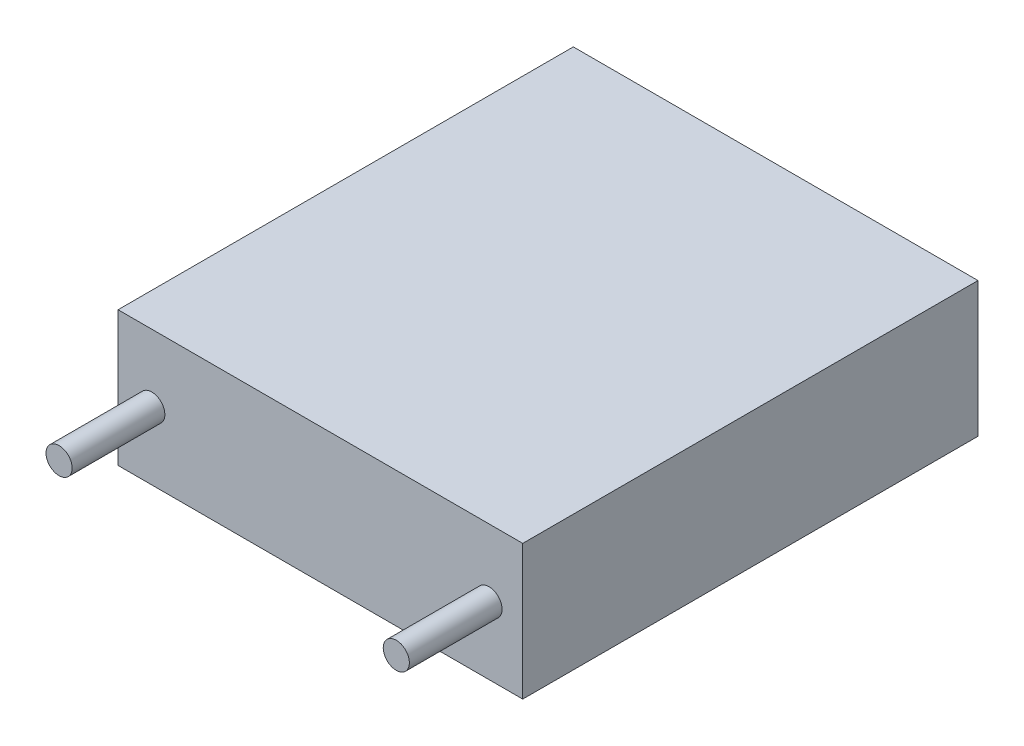
ISO-10303-21;
HEADER;
FILE_DESCRIPTION(('STEP AP214'),'2;1');
FILE_NAME('part.step','',(''),(''),'','','');
FILE_SCHEMA(('AUTOMOTIVE_DESIGN { 1 0 10303 214 1 1 1 1 }'));
ENDSEC;
DATA;
#1=APPLICATION_CONTEXT('core data for automotive mechanical design processes');
#2=APPLICATION_PROTOCOL_DEFINITION('international standard','automotive_design',2000,#1);
#3=PRODUCT_CONTEXT('',#1,'mechanical');
#4=PRODUCT('Part','Part','',(#3));
#5=PRODUCT_RELATED_PRODUCT_CATEGORY('part','',(#4));
#6=PRODUCT_DEFINITION_FORMATION('','',#4);
#7=PRODUCT_DEFINITION_CONTEXT('part definition',#1,'design');
#8=PRODUCT_DEFINITION('design','',#6,#7);
#9=PRODUCT_DEFINITION_SHAPE('','',#8);
#10=(LENGTH_UNIT() NAMED_UNIT(*) SI_UNIT(.MILLI.,.METRE.));
#11=(NAMED_UNIT(*) PLANE_ANGLE_UNIT() SI_UNIT($,.RADIAN.));
#12=(NAMED_UNIT(*) SI_UNIT($,.STERADIAN.) SOLID_ANGLE_UNIT());
#13=UNCERTAINTY_MEASURE_WITH_UNIT(LENGTH_MEASURE(1.E-05),#10,'distance_accuracy_value','');
#14=(GEOMETRIC_REPRESENTATION_CONTEXT(3) GLOBAL_UNCERTAINTY_ASSIGNED_CONTEXT((#13)) GLOBAL_UNIT_ASSIGNED_CONTEXT((#10,
#11,#12)) REPRESENTATION_CONTEXT('',''));
#15=CARTESIAN_POINT('',(0.,0.,0.));
#16=DIRECTION('',(0.,0.,1.));
#17=DIRECTION('',(1.,0.,0.));
#18=AXIS2_PLACEMENT_3D('',#15,#16,#17);
#19=CARTESIAN_POINT('',(0.,8.,27.));
#20=DIRECTION('',(0.,0.,-1.));
#21=DIRECTION('',(-1.,0.,0.));
#22=AXIS2_PLACEMENT_3D('',#19,#20,#21);
#23=PLANE('',#22);
#24=CARTESIAN_POINT('',(2.,4.,27.));
#25=DIRECTION('',(0.,0.,-1.));
#26=DIRECTION('',(-1.,0.,0.));
#27=AXIS2_PLACEMENT_3D('',#24,#25,#26);
#28=CIRCLE('',#27,0.774571480334662);
#29=CARTESIAN_POINT('',(1.22542851966534,4.,27.));
#30=VERTEX_POINT('',#29);
#31=EDGE_CURVE('E37',#30,#30,#28,.F.);
#32=ORIENTED_EDGE('',*,*,#31,.F.);
#33=EDGE_LOOP('',(#32));
#34=FACE_BOUND('',#33,.T.);
#35=DIRECTION('',(0.,-1.,0.));
#36=VECTOR('',#35,1.);
#37=CARTESIAN_POINT('',(0.,0.,27.));
#38=LINE('',#37,#36);
#39=CARTESIAN_POINT('',(0.,8.,27.));
#40=VERTEX_POINT('',#39);
#41=CARTESIAN_POINT('',(0.,0.,27.));
#42=VERTEX_POINT('',#41);
#43=EDGE_CURVE('E101',#40,#42,#38,.T.);
#44=ORIENTED_EDGE('',*,*,#43,.T.);
#45=DIRECTION('',(1.,0.,0.));
#46=VECTOR('',#45,1.);
#47=CARTESIAN_POINT('',(0.,0.,27.));
#48=LINE('',#47,#46);
#49=CARTESIAN_POINT('',(24.,0.,27.));
#50=VERTEX_POINT('',#49);
#51=EDGE_CURVE('E84',#42,#50,#48,.T.);
#52=ORIENTED_EDGE('',*,*,#51,.T.);
#53=DIRECTION('',(0.,1.,0.));
#54=VECTOR('',#53,1.);
#55=CARTESIAN_POINT('',(24.,0.,27.));
#56=LINE('',#55,#54);
#57=CARTESIAN_POINT('',(24.,8.,27.));
#58=VERTEX_POINT('',#57);
#59=EDGE_CURVE('E49',#50,#58,#56,.T.);
#60=ORIENTED_EDGE('',*,*,#59,.T.);
#61=DIRECTION('',(-1.,0.,0.));
#62=VECTOR('',#61,1.);
#63=CARTESIAN_POINT('',(0.,8.,27.));
#64=LINE('',#63,#62);
#65=EDGE_CURVE('E44',#58,#40,#64,.T.);
#66=ORIENTED_EDGE('',*,*,#65,.T.);
#67=EDGE_LOOP('',(#44,#52,#60,#66));
#68=FACE_BOUND('',#67,.T.);
#69=CARTESIAN_POINT('',(22.,4.,27.));
#70=DIRECTION('',(0.,0.,-1.));
#71=DIRECTION('',(-1.,0.,0.));
#72=AXIS2_PLACEMENT_3D('',#69,#70,#71);
#73=CIRCLE('',#72,0.774571480334662);
#74=CARTESIAN_POINT('',(21.2254285196653,4.,27.));
#75=VERTEX_POINT('',#74);
#76=EDGE_CURVE('E11',#75,#75,#73,.F.);
#77=ORIENTED_EDGE('',*,*,#76,.F.);
#78=EDGE_LOOP('',(#77));
#79=FACE_BOUND('',#78,.T.);
#80=ADVANCED_FACE('F29',(#34,#68,#79),#23,.F.);
#81=CARTESIAN_POINT('',(0.,0.,27.));
#82=DIRECTION('',(1.,0.,0.));
#83=DIRECTION('',(0.,0.,-1.));
#84=AXIS2_PLACEMENT_3D('',#81,#82,#83);
#85=PLANE('',#84);
#86=DIRECTION('',(0.,-1.,0.));
#87=VECTOR('',#86,1.);
#88=CARTESIAN_POINT('',(0.,0.,0.));
#89=LINE('',#88,#87);
#90=CARTESIAN_POINT('',(0.,8.,0.));
#91=VERTEX_POINT('',#90);
#92=CARTESIAN_POINT('',(0.,0.,0.));
#93=VERTEX_POINT('',#92);
#94=EDGE_CURVE('E75',#91,#93,#89,.T.);
#95=ORIENTED_EDGE('',*,*,#94,.T.);
#96=DIRECTION('',(0.,0.,-1.));
#97=VECTOR('',#96,1.);
#98=CARTESIAN_POINT('',(0.,0.,27.));
#99=LINE('',#98,#97);
#100=EDGE_CURVE('E82',#42,#93,#99,.T.);
#101=ORIENTED_EDGE('',*,*,#100,.F.);
#102=ORIENTED_EDGE('',*,*,#43,.F.);
#103=DIRECTION('',(0.,0.,-1.));
#104=VECTOR('',#103,1.);
#105=CARTESIAN_POINT('',(0.,8.,27.));
#106=LINE('',#105,#104);
#107=EDGE_CURVE('E90',#40,#91,#106,.T.);
#108=ORIENTED_EDGE('',*,*,#107,.T.);
#109=EDGE_LOOP('',(#95,#101,#102,#108));
#110=FACE_BOUND('',#109,.T.);
#111=ADVANCED_FACE('F31',(#110),#85,.F.);
#112=CARTESIAN_POINT('',(0.,0.,27.));
#113=DIRECTION('',(0.,1.,0.));
#114=DIRECTION('',(0.,0.,1.));
#115=AXIS2_PLACEMENT_3D('',#112,#113,#114);
#116=PLANE('',#115);
#117=DIRECTION('',(1.,0.,0.));
#118=VECTOR('',#117,1.);
#119=CARTESIAN_POINT('',(0.,0.,0.));
#120=LINE('',#119,#118);
#121=CARTESIAN_POINT('',(24.,0.,0.));
#122=VERTEX_POINT('',#121);
#123=EDGE_CURVE('E70',#93,#122,#120,.T.);
#124=ORIENTED_EDGE('',*,*,#123,.T.);
#125=DIRECTION('',(0.,0.,-1.));
#126=VECTOR('',#125,1.);
#127=CARTESIAN_POINT('',(24.,0.,27.));
#128=LINE('',#127,#126);
#129=EDGE_CURVE('E87',#50,#122,#128,.T.);
#130=ORIENTED_EDGE('',*,*,#129,.F.);
#131=ORIENTED_EDGE('',*,*,#51,.F.);
#132=ORIENTED_EDGE('',*,*,#100,.T.);
#133=EDGE_LOOP('',(#124,#130,#131,#132));
#134=FACE_BOUND('',#133,.T.);
#135=ADVANCED_FACE('F83',(#134),#116,.F.);
#136=CARTESIAN_POINT('',(24.,0.,27.));
#137=DIRECTION('',(-1.,0.,0.));
#138=DIRECTION('',(0.,0.,1.));
#139=AXIS2_PLACEMENT_3D('',#136,#137,#138);
#140=PLANE('',#139);
#141=DIRECTION('',(0.,1.,0.));
#142=VECTOR('',#141,1.);
#143=CARTESIAN_POINT('',(24.,0.,0.));
#144=LINE('',#143,#142);
#145=CARTESIAN_POINT('',(24.,8.,0.));
#146=VERTEX_POINT('',#145);
#147=EDGE_CURVE('E76',#122,#146,#144,.T.);
#148=ORIENTED_EDGE('',*,*,#147,.T.);
#149=DIRECTION('',(0.,0.,-1.));
#150=VECTOR('',#149,1.);
#151=CARTESIAN_POINT('',(24.,8.,27.));
#152=LINE('',#151,#150);
#153=EDGE_CURVE('E107',#58,#146,#152,.T.);
#154=ORIENTED_EDGE('',*,*,#153,.F.);
#155=ORIENTED_EDGE('',*,*,#59,.F.);
#156=ORIENTED_EDGE('',*,*,#129,.T.);
#157=EDGE_LOOP('',(#148,#154,#155,#156));
#158=FACE_BOUND('',#157,.T.);
#159=ADVANCED_FACE('F144',(#158),#140,.F.);
#160=CARTESIAN_POINT('',(0.,8.,27.));
#161=DIRECTION('',(0.,-1.,0.));
#162=DIRECTION('',(0.,0.,-1.));
#163=AXIS2_PLACEMENT_3D('',#160,#161,#162);
#164=PLANE('',#163);
#165=DIRECTION('',(-1.,0.,0.));
#166=VECTOR('',#165,1.);
#167=CARTESIAN_POINT('',(0.,8.,0.));
#168=LINE('',#167,#166);
#169=EDGE_CURVE('E99',#146,#91,#168,.T.);
#170=ORIENTED_EDGE('',*,*,#169,.T.);
#171=ORIENTED_EDGE('',*,*,#107,.F.);
#172=ORIENTED_EDGE('',*,*,#65,.F.);
#173=ORIENTED_EDGE('',*,*,#153,.T.);
#174=EDGE_LOOP('',(#170,#171,#172,#173));
#175=FACE_BOUND('',#174,.T.);
#176=ADVANCED_FACE('F140',(#175),#164,.F.);
#177=CARTESIAN_POINT('',(0.,8.,0.));
#178=DIRECTION('',(0.,0.,-1.));
#179=DIRECTION('',(-1.,0.,0.));
#180=AXIS2_PLACEMENT_3D('',#177,#178,#179);
#181=PLANE('',#180);
#182=ORIENTED_EDGE('',*,*,#94,.F.);
#183=ORIENTED_EDGE('',*,*,#169,.F.);
#184=ORIENTED_EDGE('',*,*,#147,.F.);
#185=ORIENTED_EDGE('',*,*,#123,.F.);
#186=EDGE_LOOP('',(#182,#183,#184,#185));
#187=FACE_BOUND('',#186,.T.);
#188=ADVANCED_FACE('F72',(#187),#181,.T.);
#189=CARTESIAN_POINT('',(2.,4.,32.5));
#190=DIRECTION('',(0.,0.,-1.));
#191=DIRECTION('',(-1.,0.,0.));
#192=AXIS2_PLACEMENT_3D('',#189,#190,#191);
#193=CYLINDRICAL_SURFACE('',#192,0.774571480334662);
#194=CARTESIAN_POINT('',(2.,4.,32.5));
#195=DIRECTION('',(0.,0.,1.));
#196=DIRECTION('',(1.,0.,0.));
#197=AXIS2_PLACEMENT_3D('',#194,#195,#196);
#198=CIRCLE('',#197,0.774571480334662);
#199=CARTESIAN_POINT('',(2.77457148033466,4.,32.5));
#200=VERTEX_POINT('',#199);
#201=EDGE_CURVE('E91',#200,#200,#198,.T.);
#202=ORIENTED_EDGE('',*,*,#201,.F.);
#203=EDGE_LOOP('',(#202));
#204=FACE_BOUND('',#203,.T.);
#205=ORIENTED_EDGE('',*,*,#31,.T.);
#206=EDGE_LOOP('',(#205));
#207=FACE_BOUND('',#206,.T.);
#208=ADVANCED_FACE('F113',(#204,#207),#193,.T.);
#209=CARTESIAN_POINT('',(2.,4.,32.5));
#210=DIRECTION('',(0.,0.,1.));
#211=DIRECTION('',(1.,0.,0.));
#212=AXIS2_PLACEMENT_3D('',#209,#210,#211);
#213=PLANE('',#212);
#214=ORIENTED_EDGE('',*,*,#201,.T.);
#215=EDGE_LOOP('',(#214));
#216=FACE_BOUND('',#215,.T.);
#217=ADVANCED_FACE('F123',(#216),#213,.T.);
#218=CARTESIAN_POINT('',(22.,4.,32.5));
#219=DIRECTION('',(0.,0.,-1.));
#220=DIRECTION('',(-1.,0.,0.));
#221=AXIS2_PLACEMENT_3D('',#218,#219,#220);
#222=CYLINDRICAL_SURFACE('',#221,0.774571480334662);
#223=CARTESIAN_POINT('',(22.,4.,32.5));
#224=DIRECTION('',(0.,0.,1.));
#225=DIRECTION('',(1.,0.,0.));
#226=AXIS2_PLACEMENT_3D('',#223,#224,#225);
#227=CIRCLE('',#226,0.774571480334662);
#228=CARTESIAN_POINT('',(22.7745714803347,4.,32.5));
#229=VERTEX_POINT('',#228);
#230=EDGE_CURVE('E94',#229,#229,#227,.T.);
#231=ORIENTED_EDGE('',*,*,#230,.F.);
#232=EDGE_LOOP('',(#231));
#233=FACE_BOUND('',#232,.T.);
#234=ORIENTED_EDGE('',*,*,#76,.T.);
#235=EDGE_LOOP('',(#234));
#236=FACE_BOUND('',#235,.T.);
#237=ADVANCED_FACE('F120',(#233,#236),#222,.T.);
#238=CARTESIAN_POINT('',(22.,4.,32.5));
#239=DIRECTION('',(0.,0.,1.));
#240=DIRECTION('',(1.,0.,0.));
#241=AXIS2_PLACEMENT_3D('',#238,#239,#240);
#242=PLANE('',#241);
#243=ORIENTED_EDGE('',*,*,#230,.T.);
#244=EDGE_LOOP('',(#243));
#245=FACE_BOUND('',#244,.T.);
#246=ADVANCED_FACE('F122',(#245),#242,.T.);
#247=CLOSED_SHELL('',(#80,#111,#135,#159,#176,#188,#208,#217,#237,#246));
#248=MANIFOLD_SOLID_BREP('B2',#247);
#249=ADVANCED_BREP_SHAPE_REPRESENTATION('',(#18,#248),#14);
#250=SHAPE_DEFINITION_REPRESENTATION(#9,#249);
ENDSEC;
END-ISO-10303-21;
